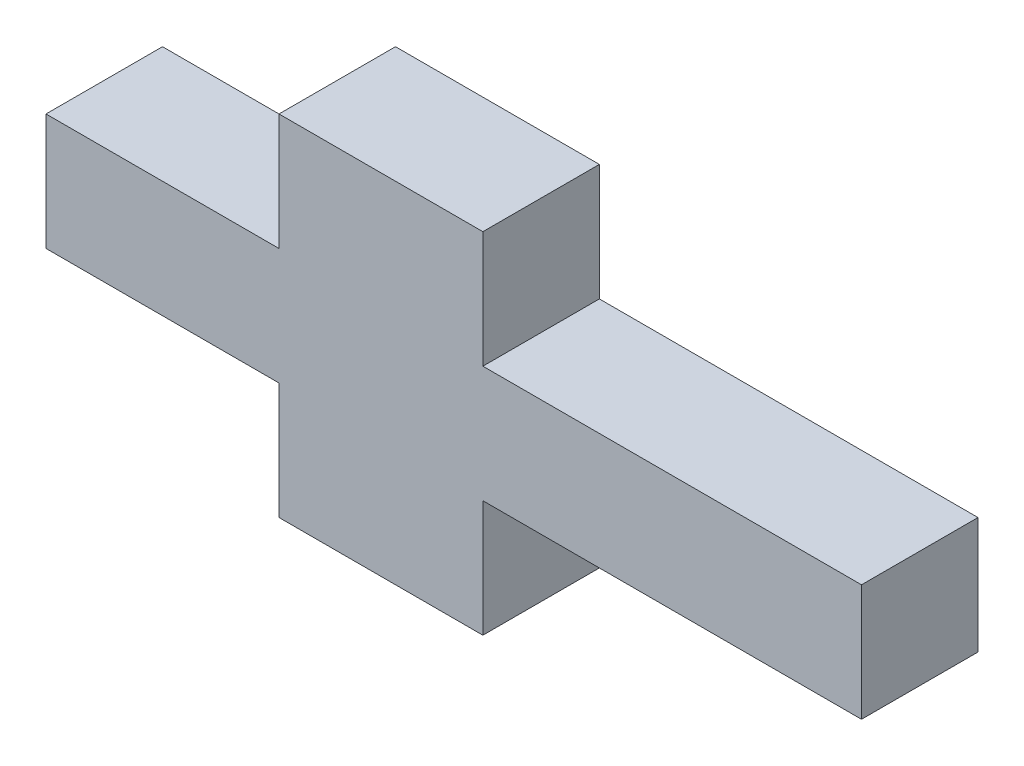
ISO-10303-21;
HEADER;
FILE_DESCRIPTION(('STEP AP214'),'2;1');
FILE_NAME('part.step','',(''),(''),'','','');
FILE_SCHEMA(('AUTOMOTIVE_DESIGN { 1 0 10303 214 1 1 1 1 }'));
ENDSEC;
DATA;
#1=APPLICATION_CONTEXT('core data for automotive mechanical design processes');
#2=APPLICATION_PROTOCOL_DEFINITION('international standard','automotive_design',2000,#1);
#3=PRODUCT_CONTEXT('',#1,'mechanical');
#4=PRODUCT('Part','Part','',(#3));
#5=PRODUCT_RELATED_PRODUCT_CATEGORY('part','',(#4));
#6=PRODUCT_DEFINITION_FORMATION('','',#4);
#7=PRODUCT_DEFINITION_CONTEXT('part definition',#1,'design');
#8=PRODUCT_DEFINITION('design','',#6,#7);
#9=PRODUCT_DEFINITION_SHAPE('','',#8);
#10=(LENGTH_UNIT() NAMED_UNIT(*) SI_UNIT(.MILLI.,.METRE.));
#11=(NAMED_UNIT(*) PLANE_ANGLE_UNIT() SI_UNIT($,.RADIAN.));
#12=(NAMED_UNIT(*) SI_UNIT($,.STERADIAN.) SOLID_ANGLE_UNIT());
#13=UNCERTAINTY_MEASURE_WITH_UNIT(LENGTH_MEASURE(1.E-05),#10,'distance_accuracy_value','');
#14=(GEOMETRIC_REPRESENTATION_CONTEXT(3) GLOBAL_UNCERTAINTY_ASSIGNED_CONTEXT((#13)) GLOBAL_UNIT_ASSIGNED_CONTEXT((#10,
#11,#12)) REPRESENTATION_CONTEXT('',''));
#15=CARTESIAN_POINT('',(0.,0.,0.));
#16=DIRECTION('',(0.,0.,1.));
#17=DIRECTION('',(1.,0.,0.));
#18=AXIS2_PLACEMENT_3D('',#15,#16,#17);
#19=CARTESIAN_POINT('',(8.,0.,4.));
#20=DIRECTION('',(0.,1.,0.));
#21=DIRECTION('',(-1.,0.,0.));
#22=AXIS2_PLACEMENT_3D('',#19,#20,#21);
#23=PLANE('',#22);
#24=DIRECTION('',(1.,0.,0.));
#25=VECTOR('',#24,1.);
#26=CARTESIAN_POINT('',(8.,0.,0.));
#27=LINE('',#26,#25);
#28=CARTESIAN_POINT('',(0.,0.,0.));
#29=VERTEX_POINT('',#28);
#30=CARTESIAN_POINT('',(8.,0.,0.));
#31=VERTEX_POINT('',#30);
#32=EDGE_CURVE('E168',#29,#31,#27,.T.);
#33=ORIENTED_EDGE('',*,*,#32,.T.);
#34=DIRECTION('',(0.,0.,-1.));
#35=VECTOR('',#34,1.);
#36=CARTESIAN_POINT('',(8.,0.,4.));
#37=LINE('',#36,#35);
#38=CARTESIAN_POINT('',(8.,0.,4.));
#39=VERTEX_POINT('',#38);
#40=EDGE_CURVE('E11',#39,#31,#37,.T.);
#41=ORIENTED_EDGE('',*,*,#40,.F.);
#42=DIRECTION('',(1.,0.,0.));
#43=VECTOR('',#42,1.);
#44=CARTESIAN_POINT('',(8.,0.,4.));
#45=LINE('',#44,#43);
#46=CARTESIAN_POINT('',(0.,0.,4.));
#47=VERTEX_POINT('',#46);
#48=EDGE_CURVE('E202',#47,#39,#45,.T.);
#49=ORIENTED_EDGE('',*,*,#48,.F.);
#50=DIRECTION('',(0.,0.,-1.));
#51=VECTOR('',#50,1.);
#52=CARTESIAN_POINT('',(0.,0.,4.));
#53=LINE('',#52,#51);
#54=EDGE_CURVE('E164',#47,#29,#53,.T.);
#55=ORIENTED_EDGE('',*,*,#54,.T.);
#56=EDGE_LOOP('',(#33,#41,#49,#55));
#57=FACE_BOUND('',#56,.T.);
#58=ADVANCED_FACE('F43',(#57),#23,.F.);
#59=CARTESIAN_POINT('',(8.,-4.,4.));
#60=DIRECTION('',(1.,0.,0.));
#61=DIRECTION('',(0.,0.,-1.));
#62=AXIS2_PLACEMENT_3D('',#59,#60,#61);
#63=PLANE('',#62);
#64=DIRECTION('',(0.,-1.,0.));
#65=VECTOR('',#64,1.);
#66=CARTESIAN_POINT('',(8.,-4.,0.));
#67=LINE('',#66,#65);
#68=CARTESIAN_POINT('',(8.,-4.,0.));
#69=VERTEX_POINT('',#68);
#70=EDGE_CURVE('E172',#31,#69,#67,.T.);
#71=ORIENTED_EDGE('',*,*,#70,.T.);
#72=DIRECTION('',(0.,0.,-1.));
#73=VECTOR('',#72,1.);
#74=CARTESIAN_POINT('',(8.,-4.,4.));
#75=LINE('',#74,#73);
#76=CARTESIAN_POINT('',(8.,-4.,4.));
#77=VERTEX_POINT('',#76);
#78=EDGE_CURVE('E52',#77,#69,#75,.T.);
#79=ORIENTED_EDGE('',*,*,#78,.F.);
#80=DIRECTION('',(0.,-1.,0.));
#81=VECTOR('',#80,1.);
#82=CARTESIAN_POINT('',(8.,-4.,4.));
#83=LINE('',#82,#81);
#84=EDGE_CURVE('E115',#39,#77,#83,.T.);
#85=ORIENTED_EDGE('',*,*,#84,.F.);
#86=ORIENTED_EDGE('',*,*,#40,.T.);
#87=EDGE_LOOP('',(#71,#79,#85,#86));
#88=FACE_BOUND('',#87,.T.);
#89=ADVANCED_FACE('F296',(#88),#63,.F.);
#90=CARTESIAN_POINT('',(15.,-4.,4.));
#91=DIRECTION('',(0.,1.,0.));
#92=DIRECTION('',(-1.,0.,0.));
#93=AXIS2_PLACEMENT_3D('',#90,#91,#92);
#94=PLANE('',#93);
#95=DIRECTION('',(1.,0.,0.));
#96=VECTOR('',#95,1.);
#97=CARTESIAN_POINT('',(15.,-4.,0.));
#98=LINE('',#97,#96);
#99=CARTESIAN_POINT('',(15.,-4.,0.));
#100=VERTEX_POINT('',#99);
#101=EDGE_CURVE('E175',#69,#100,#98,.T.);
#102=ORIENTED_EDGE('',*,*,#101,.T.);
#103=DIRECTION('',(0.,0.,-1.));
#104=VECTOR('',#103,1.);
#105=CARTESIAN_POINT('',(15.,-4.,4.));
#106=LINE('',#105,#104);
#107=CARTESIAN_POINT('',(15.,-4.,4.));
#108=VERTEX_POINT('',#107);
#109=EDGE_CURVE('E229',#108,#100,#106,.T.);
#110=ORIENTED_EDGE('',*,*,#109,.F.);
#111=DIRECTION('',(1.,0.,0.));
#112=VECTOR('',#111,1.);
#113=CARTESIAN_POINT('',(15.,-4.,4.));
#114=LINE('',#113,#112);
#115=EDGE_CURVE('E239',#77,#108,#114,.T.);
#116=ORIENTED_EDGE('',*,*,#115,.F.);
#117=ORIENTED_EDGE('',*,*,#78,.T.);
#118=EDGE_LOOP('',(#102,#110,#116,#117));
#119=FACE_BOUND('',#118,.T.);
#120=ADVANCED_FACE('F237',(#119),#94,.F.);
#121=CARTESIAN_POINT('',(15.,0.,4.));
#122=DIRECTION('',(-1.,0.,0.));
#123=DIRECTION('',(0.,0.,1.));
#124=AXIS2_PLACEMENT_3D('',#121,#122,#123);
#125=PLANE('',#124);
#126=DIRECTION('',(0.,1.,0.));
#127=VECTOR('',#126,1.);
#128=CARTESIAN_POINT('',(15.,0.,0.));
#129=LINE('',#128,#127);
#130=CARTESIAN_POINT('',(15.,0.,0.));
#131=VERTEX_POINT('',#130);
#132=EDGE_CURVE('E178',#100,#131,#129,.T.);
#133=ORIENTED_EDGE('',*,*,#132,.T.);
#134=DIRECTION('',(0.,0.,-1.));
#135=VECTOR('',#134,1.);
#136=CARTESIAN_POINT('',(15.,0.,4.));
#137=LINE('',#136,#135);
#138=CARTESIAN_POINT('',(15.,0.,4.));
#139=VERTEX_POINT('',#138);
#140=EDGE_CURVE('E225',#139,#131,#137,.T.);
#141=ORIENTED_EDGE('',*,*,#140,.F.);
#142=DIRECTION('',(0.,1.,0.));
#143=VECTOR('',#142,1.);
#144=CARTESIAN_POINT('',(15.,0.,4.));
#145=LINE('',#144,#143);
#146=EDGE_CURVE('E258',#108,#139,#145,.T.);
#147=ORIENTED_EDGE('',*,*,#146,.F.);
#148=ORIENTED_EDGE('',*,*,#109,.T.);
#149=EDGE_LOOP('',(#133,#141,#147,#148));
#150=FACE_BOUND('',#149,.T.);
#151=ADVANCED_FACE('F248',(#150),#125,.F.);
#152=CARTESIAN_POINT('',(28.,0.,4.));
#153=DIRECTION('',(0.,1.,0.));
#154=DIRECTION('',(-1.,0.,0.));
#155=AXIS2_PLACEMENT_3D('',#152,#153,#154);
#156=PLANE('',#155);
#157=DIRECTION('',(1.,0.,0.));
#158=VECTOR('',#157,1.);
#159=CARTESIAN_POINT('',(28.,0.,0.));
#160=LINE('',#159,#158);
#161=CARTESIAN_POINT('',(28.,0.,0.));
#162=VERTEX_POINT('',#161);
#163=EDGE_CURVE('E181',#131,#162,#160,.T.);
#164=ORIENTED_EDGE('',*,*,#163,.T.);
#165=DIRECTION('',(0.,0.,-1.));
#166=VECTOR('',#165,1.);
#167=CARTESIAN_POINT('',(28.,0.,4.));
#168=LINE('',#167,#166);
#169=CARTESIAN_POINT('',(28.,0.,4.));
#170=VERTEX_POINT('',#169);
#171=EDGE_CURVE('E221',#170,#162,#168,.T.);
#172=ORIENTED_EDGE('',*,*,#171,.F.);
#173=DIRECTION('',(1.,0.,0.));
#174=VECTOR('',#173,1.);
#175=CARTESIAN_POINT('',(28.,0.,4.));
#176=LINE('',#175,#174);
#177=EDGE_CURVE('E254',#139,#170,#176,.T.);
#178=ORIENTED_EDGE('',*,*,#177,.F.);
#179=ORIENTED_EDGE('',*,*,#140,.T.);
#180=EDGE_LOOP('',(#164,#172,#178,#179));
#181=FACE_BOUND('',#180,.T.);
#182=ADVANCED_FACE('F252',(#181),#156,.F.);
#183=CARTESIAN_POINT('',(28.,4.,4.));
#184=DIRECTION('',(-1.,0.,0.));
#185=DIRECTION('',(0.,0.,1.));
#186=AXIS2_PLACEMENT_3D('',#183,#184,#185);
#187=PLANE('',#186);
#188=DIRECTION('',(0.,1.,0.));
#189=VECTOR('',#188,1.);
#190=CARTESIAN_POINT('',(28.,4.,0.));
#191=LINE('',#190,#189);
#192=CARTESIAN_POINT('',(28.,4.,0.));
#193=VERTEX_POINT('',#192);
#194=EDGE_CURVE('E184',#162,#193,#191,.T.);
#195=ORIENTED_EDGE('',*,*,#194,.T.);
#196=DIRECTION('',(0.,0.,-1.));
#197=VECTOR('',#196,1.);
#198=CARTESIAN_POINT('',(28.,4.,4.));
#199=LINE('',#198,#197);
#200=CARTESIAN_POINT('',(28.,4.,4.));
#201=VERTEX_POINT('',#200);
#202=EDGE_CURVE('E217',#201,#193,#199,.T.);
#203=ORIENTED_EDGE('',*,*,#202,.F.);
#204=DIRECTION('',(0.,1.,0.));
#205=VECTOR('',#204,1.);
#206=CARTESIAN_POINT('',(28.,4.,4.));
#207=LINE('',#206,#205);
#208=EDGE_CURVE('E257',#170,#201,#207,.T.);
#209=ORIENTED_EDGE('',*,*,#208,.F.);
#210=ORIENTED_EDGE('',*,*,#171,.T.);
#211=EDGE_LOOP('',(#195,#203,#209,#210));
#212=FACE_BOUND('',#211,.T.);
#213=ADVANCED_FACE('F309',(#212),#187,.F.);
#214=CARTESIAN_POINT('',(15.,4.,4.));
#215=DIRECTION('',(0.,-1.,0.));
#216=DIRECTION('',(0.,0.,-1.));
#217=AXIS2_PLACEMENT_3D('',#214,#215,#216);
#218=PLANE('',#217);
#219=DIRECTION('',(-1.,0.,0.));
#220=VECTOR('',#219,1.);
#221=CARTESIAN_POINT('',(15.,4.,0.));
#222=LINE('',#221,#220);
#223=CARTESIAN_POINT('',(15.,4.,0.));
#224=VERTEX_POINT('',#223);
#225=EDGE_CURVE('E187',#193,#224,#222,.T.);
#226=ORIENTED_EDGE('',*,*,#225,.T.);
#227=DIRECTION('',(0.,0.,-1.));
#228=VECTOR('',#227,1.);
#229=CARTESIAN_POINT('',(15.,4.,4.));
#230=LINE('',#229,#228);
#231=CARTESIAN_POINT('',(15.,4.,4.));
#232=VERTEX_POINT('',#231);
#233=EDGE_CURVE('E213',#232,#224,#230,.T.);
#234=ORIENTED_EDGE('',*,*,#233,.F.);
#235=DIRECTION('',(-1.,0.,0.));
#236=VECTOR('',#235,1.);
#237=CARTESIAN_POINT('',(15.,4.,4.));
#238=LINE('',#237,#236);
#239=EDGE_CURVE('E262',#201,#232,#238,.T.);
#240=ORIENTED_EDGE('',*,*,#239,.F.);
#241=ORIENTED_EDGE('',*,*,#202,.T.);
#242=EDGE_LOOP('',(#226,#234,#240,#241));
#243=FACE_BOUND('',#242,.T.);
#244=ADVANCED_FACE('F312',(#243),#218,.F.);
#245=CARTESIAN_POINT('',(15.,8.,4.));
#246=DIRECTION('',(-1.,0.,0.));
#247=DIRECTION('',(0.,0.,1.));
#248=AXIS2_PLACEMENT_3D('',#245,#246,#247);
#249=PLANE('',#248);
#250=DIRECTION('',(0.,1.,0.));
#251=VECTOR('',#250,1.);
#252=CARTESIAN_POINT('',(15.,8.,0.));
#253=LINE('',#252,#251);
#254=CARTESIAN_POINT('',(15.,8.,0.));
#255=VERTEX_POINT('',#254);
#256=EDGE_CURVE('E190',#224,#255,#253,.T.);
#257=ORIENTED_EDGE('',*,*,#256,.T.);
#258=DIRECTION('',(0.,0.,-1.));
#259=VECTOR('',#258,1.);
#260=CARTESIAN_POINT('',(15.,8.,4.));
#261=LINE('',#260,#259);
#262=CARTESIAN_POINT('',(15.,8.,4.));
#263=VERTEX_POINT('',#262);
#264=EDGE_CURVE('E209',#263,#255,#261,.T.);
#265=ORIENTED_EDGE('',*,*,#264,.F.);
#266=DIRECTION('',(0.,1.,0.));
#267=VECTOR('',#266,1.);
#268=CARTESIAN_POINT('',(15.,8.,4.));
#269=LINE('',#268,#267);
#270=EDGE_CURVE('E269',#232,#263,#269,.T.);
#271=ORIENTED_EDGE('',*,*,#270,.F.);
#272=ORIENTED_EDGE('',*,*,#233,.T.);
#273=EDGE_LOOP('',(#257,#265,#271,#272));
#274=FACE_BOUND('',#273,.T.);
#275=ADVANCED_FACE('F277',(#274),#249,.F.);
#276=CARTESIAN_POINT('',(8.,8.,4.));
#277=DIRECTION('',(0.,-1.,0.));
#278=DIRECTION('',(0.,0.,-1.));
#279=AXIS2_PLACEMENT_3D('',#276,#277,#278);
#280=PLANE('',#279);
#281=DIRECTION('',(-1.,0.,0.));
#282=VECTOR('',#281,1.);
#283=CARTESIAN_POINT('',(8.,8.,0.));
#284=LINE('',#283,#282);
#285=CARTESIAN_POINT('',(8.,8.,0.));
#286=VERTEX_POINT('',#285);
#287=EDGE_CURVE('E193',#255,#286,#284,.T.);
#288=ORIENTED_EDGE('',*,*,#287,.T.);
#289=DIRECTION('',(0.,0.,-1.));
#290=VECTOR('',#289,1.);
#291=CARTESIAN_POINT('',(8.,8.,4.));
#292=LINE('',#291,#290);
#293=CARTESIAN_POINT('',(8.,8.,4.));
#294=VERTEX_POINT('',#293);
#295=EDGE_CURVE('E157',#294,#286,#292,.T.);
#296=ORIENTED_EDGE('',*,*,#295,.F.);
#297=DIRECTION('',(-1.,0.,0.));
#298=VECTOR('',#297,1.);
#299=CARTESIAN_POINT('',(8.,8.,4.));
#300=LINE('',#299,#298);
#301=EDGE_CURVE('E146',#263,#294,#300,.T.);
#302=ORIENTED_EDGE('',*,*,#301,.F.);
#303=ORIENTED_EDGE('',*,*,#264,.T.);
#304=EDGE_LOOP('',(#288,#296,#302,#303));
#305=FACE_BOUND('',#304,.T.);
#306=ADVANCED_FACE('F281',(#305),#280,.F.);
#307=CARTESIAN_POINT('',(8.,4.,4.));
#308=DIRECTION('',(1.,0.,0.));
#309=DIRECTION('',(0.,0.,-1.));
#310=AXIS2_PLACEMENT_3D('',#307,#308,#309);
#311=PLANE('',#310);
#312=DIRECTION('',(0.,-1.,0.));
#313=VECTOR('',#312,1.);
#314=CARTESIAN_POINT('',(8.,4.,0.));
#315=LINE('',#314,#313);
#316=CARTESIAN_POINT('',(8.,4.,0.));
#317=VERTEX_POINT('',#316);
#318=EDGE_CURVE('E155',#286,#317,#315,.T.);
#319=ORIENTED_EDGE('',*,*,#318,.T.);
#320=DIRECTION('',(0.,0.,-1.));
#321=VECTOR('',#320,1.);
#322=CARTESIAN_POINT('',(8.,4.,4.));
#323=LINE('',#322,#321);
#324=CARTESIAN_POINT('',(8.,4.,4.));
#325=VERTEX_POINT('',#324);
#326=EDGE_CURVE('E152',#325,#317,#323,.T.);
#327=ORIENTED_EDGE('',*,*,#326,.F.);
#328=DIRECTION('',(0.,-1.,0.));
#329=VECTOR('',#328,1.);
#330=CARTESIAN_POINT('',(8.,4.,4.));
#331=LINE('',#330,#329);
#332=EDGE_CURVE('E140',#294,#325,#331,.T.);
#333=ORIENTED_EDGE('',*,*,#332,.F.);
#334=ORIENTED_EDGE('',*,*,#295,.T.);
#335=EDGE_LOOP('',(#319,#327,#333,#334));
#336=FACE_BOUND('',#335,.T.);
#337=ADVANCED_FACE('F153',(#336),#311,.F.);
#338=CARTESIAN_POINT('',(0.,4.,4.));
#339=DIRECTION('',(0.,-1.,0.));
#340=DIRECTION('',(1.,0.,0.));
#341=AXIS2_PLACEMENT_3D('',#338,#339,#340);
#342=PLANE('',#341);
#343=DIRECTION('',(-1.,0.,0.));
#344=VECTOR('',#343,1.);
#345=CARTESIAN_POINT('',(0.,4.,0.));
#346=LINE('',#345,#344);
#347=CARTESIAN_POINT('',(0.,4.,0.));
#348=VERTEX_POINT('',#347);
#349=EDGE_CURVE('E101',#317,#348,#346,.T.);
#350=ORIENTED_EDGE('',*,*,#349,.T.);
#351=DIRECTION('',(0.,0.,-1.));
#352=VECTOR('',#351,1.);
#353=CARTESIAN_POINT('',(0.,4.,4.));
#354=LINE('',#353,#352);
#355=CARTESIAN_POINT('',(0.,4.,4.));
#356=VERTEX_POINT('',#355);
#357=EDGE_CURVE('E158',#356,#348,#354,.T.);
#358=ORIENTED_EDGE('',*,*,#357,.F.);
#359=DIRECTION('',(-1.,0.,0.));
#360=VECTOR('',#359,1.);
#361=CARTESIAN_POINT('',(0.,4.,4.));
#362=LINE('',#361,#360);
#363=EDGE_CURVE('E144',#325,#356,#362,.T.);
#364=ORIENTED_EDGE('',*,*,#363,.F.);
#365=ORIENTED_EDGE('',*,*,#326,.T.);
#366=EDGE_LOOP('',(#350,#358,#364,#365));
#367=FACE_BOUND('',#366,.T.);
#368=ADVANCED_FACE('F160',(#367),#342,.F.);
#369=CARTESIAN_POINT('',(0.,0.,4.));
#370=DIRECTION('',(1.,0.,0.));
#371=DIRECTION('',(0.,0.,-1.));
#372=AXIS2_PLACEMENT_3D('',#369,#370,#371);
#373=PLANE('',#372);
#374=DIRECTION('',(0.,-1.,0.));
#375=VECTOR('',#374,1.);
#376=CARTESIAN_POINT('',(0.,0.,0.));
#377=LINE('',#376,#375);
#378=EDGE_CURVE('E107',#348,#29,#377,.T.);
#379=ORIENTED_EDGE('',*,*,#378,.T.);
#380=ORIENTED_EDGE('',*,*,#54,.F.);
#381=DIRECTION('',(0.,-1.,0.));
#382=VECTOR('',#381,1.);
#383=CARTESIAN_POINT('',(0.,0.,4.));
#384=LINE('',#383,#382);
#385=EDGE_CURVE('E60',#356,#47,#384,.T.);
#386=ORIENTED_EDGE('',*,*,#385,.F.);
#387=ORIENTED_EDGE('',*,*,#357,.T.);
#388=EDGE_LOOP('',(#379,#380,#386,#387));
#389=FACE_BOUND('',#388,.T.);
#390=ADVANCED_FACE('F285',(#389),#373,.F.);
#391=CARTESIAN_POINT('',(0.,0.,4.));
#392=DIRECTION('',(0.,0.,-1.));
#393=DIRECTION('',(-1.,0.,0.));
#394=AXIS2_PLACEMENT_3D('',#391,#392,#393);
#395=PLANE('',#394);
#396=ORIENTED_EDGE('',*,*,#48,.T.);
#397=ORIENTED_EDGE('',*,*,#84,.T.);
#398=ORIENTED_EDGE('',*,*,#115,.T.);
#399=ORIENTED_EDGE('',*,*,#146,.T.);
#400=ORIENTED_EDGE('',*,*,#177,.T.);
#401=ORIENTED_EDGE('',*,*,#208,.T.);
#402=ORIENTED_EDGE('',*,*,#239,.T.);
#403=ORIENTED_EDGE('',*,*,#270,.T.);
#404=ORIENTED_EDGE('',*,*,#301,.T.);
#405=ORIENTED_EDGE('',*,*,#332,.T.);
#406=ORIENTED_EDGE('',*,*,#363,.T.);
#407=ORIENTED_EDGE('',*,*,#385,.T.);
#408=EDGE_LOOP('',(#396,#397,#398,#399,#400,#401,#402,#403,#404,#405,#406,#407));
#409=FACE_BOUND('',#408,.T.);
#410=ADVANCED_FACE('F142',(#409),#395,.F.);
#411=CARTESIAN_POINT('',(0.,0.,0.));
#412=DIRECTION('',(0.,0.,-1.));
#413=DIRECTION('',(-1.,0.,0.));
#414=AXIS2_PLACEMENT_3D('',#411,#412,#413);
#415=PLANE('',#414);
#416=ORIENTED_EDGE('',*,*,#32,.F.);
#417=ORIENTED_EDGE('',*,*,#378,.F.);
#418=ORIENTED_EDGE('',*,*,#349,.F.);
#419=ORIENTED_EDGE('',*,*,#318,.F.);
#420=ORIENTED_EDGE('',*,*,#287,.F.);
#421=ORIENTED_EDGE('',*,*,#256,.F.);
#422=ORIENTED_EDGE('',*,*,#225,.F.);
#423=ORIENTED_EDGE('',*,*,#194,.F.);
#424=ORIENTED_EDGE('',*,*,#163,.F.);
#425=ORIENTED_EDGE('',*,*,#132,.F.);
#426=ORIENTED_EDGE('',*,*,#101,.F.);
#427=ORIENTED_EDGE('',*,*,#70,.F.);
#428=EDGE_LOOP('',(#416,#417,#418,#419,#420,#421,#422,#423,#424,#425,#426,#427));
#429=FACE_BOUND('',#428,.T.);
#430=ADVANCED_FACE('F243',(#429),#415,.T.);
#431=CLOSED_SHELL('',(#58,#89,#120,#151,#182,#213,#244,#275,#306,#337,#368,#390,#410,#430));
#432=MANIFOLD_SOLID_BREP('B2',#431);
#433=ADVANCED_BREP_SHAPE_REPRESENTATION('',(#18,#432),#14);
#434=SHAPE_DEFINITION_REPRESENTATION(#9,#433);
ENDSEC;
END-ISO-10303-21;
